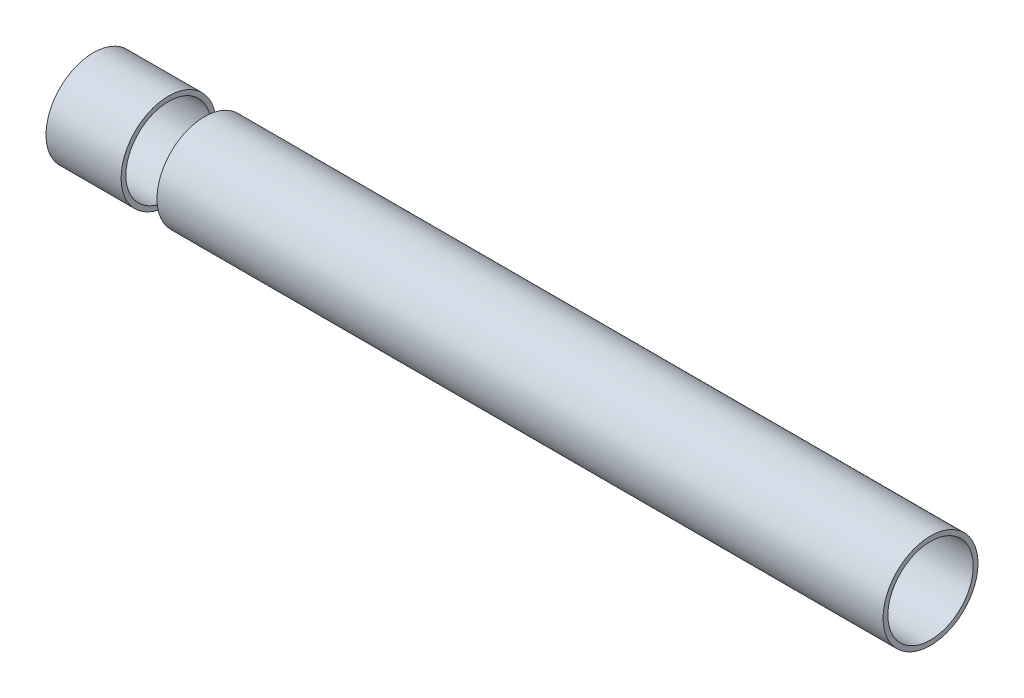
ISO-10303-21;
HEADER;
FILE_DESCRIPTION(('STEP AP214'),'2;1');
FILE_NAME('part.step','',(''),(''),'','','');
FILE_SCHEMA(('AUTOMOTIVE_DESIGN { 1 0 10303 214 1 1 1 1 }'));
ENDSEC;
DATA;
#1=APPLICATION_CONTEXT('core data for automotive mechanical design processes');
#2=APPLICATION_PROTOCOL_DEFINITION('international standard','automotive_design',2000,#1);
#3=PRODUCT_CONTEXT('',#1,'mechanical');
#4=PRODUCT('Part','Part','',(#3));
#5=PRODUCT_RELATED_PRODUCT_CATEGORY('part','',(#4));
#6=PRODUCT_DEFINITION_FORMATION('','',#4);
#7=PRODUCT_DEFINITION_CONTEXT('part definition',#1,'design');
#8=PRODUCT_DEFINITION('design','',#6,#7);
#9=PRODUCT_DEFINITION_SHAPE('','',#8);
#10=(LENGTH_UNIT() NAMED_UNIT(*) SI_UNIT(.MILLI.,.METRE.));
#11=(NAMED_UNIT(*) PLANE_ANGLE_UNIT() SI_UNIT($,.RADIAN.));
#12=(NAMED_UNIT(*) SI_UNIT($,.STERADIAN.) SOLID_ANGLE_UNIT());
#13=UNCERTAINTY_MEASURE_WITH_UNIT(LENGTH_MEASURE(1.E-05),#10,'distance_accuracy_value','');
#14=(GEOMETRIC_REPRESENTATION_CONTEXT(3) GLOBAL_UNCERTAINTY_ASSIGNED_CONTEXT((#13)) GLOBAL_UNIT_ASSIGNED_CONTEXT((#10,
#11,#12)) REPRESENTATION_CONTEXT('',''));
#15=CARTESIAN_POINT('',(0.,0.,0.));
#16=DIRECTION('',(0.,0.,1.));
#17=DIRECTION('',(1.,0.,0.));
#18=AXIS2_PLACEMENT_3D('',#15,#16,#17);
#19=CARTESIAN_POINT('',(140.019255902,0.,0.));
#20=DIRECTION('',(-1.,0.,0.));
#21=DIRECTION('',(0.,0.,1.));
#22=AXIS2_PLACEMENT_3D('',#19,#20,#21);
#23=CYLINDRICAL_SURFACE('',#22,15.875);
#24=CARTESIAN_POINT('',(-140.019255902,0.,0.));
#25=DIRECTION('',(1.,0.,0.));
#26=DIRECTION('',(0.,0.,-1.));
#27=AXIS2_PLACEMENT_3D('',#24,#25,#26);
#28=CIRCLE('',#27,15.875);
#29=CARTESIAN_POINT('',(-140.019255902,0.,-15.875));
#30=VERTEX_POINT('',#29);
#31=EDGE_CURVE('E12',#30,#30,#28,.T.);
#32=ORIENTED_EDGE('',*,*,#31,.T.);
#33=EDGE_LOOP('',(#32));
#34=FACE_BOUND('',#33,.T.);
#35=CARTESIAN_POINT('',(-114.895310976,0.,0.));
#36=DIRECTION('',(-1.,0.,0.));
#37=DIRECTION('',(0.,0.,1.));
#38=AXIS2_PLACEMENT_3D('',#35,#36,#37);
#39=CIRCLE('',#38,15.875);
#40=CARTESIAN_POINT('',(-114.895310976,0.,15.875));
#41=VERTEX_POINT('',#40);
#42=EDGE_CURVE('E68',#41,#41,#39,.T.);
#43=ORIENTED_EDGE('',*,*,#42,.T.);
#44=EDGE_LOOP('',(#43));
#45=FACE_BOUND('',#44,.T.);
#46=ADVANCED_FACE('F57',(#34,#45),#23,.T.);
#47=CARTESIAN_POINT('',(-140.019255902,0.,0.));
#48=DIRECTION('',(1.,0.,0.));
#49=DIRECTION('',(0.,0.,-1.));
#50=AXIS2_PLACEMENT_3D('',#47,#48,#49);
#51=PLANE('',#50);
#52=ORIENTED_EDGE('',*,*,#31,.F.);
#53=EDGE_LOOP('',(#52));
#54=FACE_BOUND('',#53,.T.);
#55=CARTESIAN_POINT('',(-140.019255902,0.,0.));
#56=DIRECTION('',(1.,0.,0.));
#57=DIRECTION('',(0.,0.,-1.));
#58=AXIS2_PLACEMENT_3D('',#55,#56,#57);
#59=CIRCLE('',#58,14.2875);
#60=CARTESIAN_POINT('',(-140.019255902,0.,-14.2875));
#61=VERTEX_POINT('',#60);
#62=EDGE_CURVE('E64',#61,#61,#59,.T.);
#63=ORIENTED_EDGE('',*,*,#62,.T.);
#64=EDGE_LOOP('',(#63));
#65=FACE_BOUND('',#64,.T.);
#66=ADVANCED_FACE('F83',(#54,#65),#51,.F.);
#67=CARTESIAN_POINT('',(140.019255902,0.,0.));
#68=DIRECTION('',(-1.,0.,0.));
#69=DIRECTION('',(0.,0.,1.));
#70=AXIS2_PLACEMENT_3D('',#67,#68,#69);
#71=CYLINDRICAL_SURFACE('',#70,14.2875);
#72=CARTESIAN_POINT('',(-114.895310976,0.,0.));
#73=DIRECTION('',(-1.,0.,0.));
#74=DIRECTION('',(0.,0.,1.));
#75=AXIS2_PLACEMENT_3D('',#72,#73,#74);
#76=CIRCLE('',#75,14.2875);
#77=CARTESIAN_POINT('',(-114.895310976,0.,14.2875));
#78=VERTEX_POINT('',#77);
#79=EDGE_CURVE('E60',#78,#78,#76,.T.);
#80=ORIENTED_EDGE('',*,*,#79,.F.);
#81=EDGE_LOOP('',(#80));
#82=FACE_BOUND('',#81,.T.);
#83=ORIENTED_EDGE('',*,*,#62,.F.);
#84=EDGE_LOOP('',(#83));
#85=FACE_BOUND('',#84,.T.);
#86=ADVANCED_FACE('F80',(#82,#85),#71,.F.);
#87=CARTESIAN_POINT('',(-114.895310976,-15.875,-15.875));
#88=DIRECTION('',(-1.,0.,0.));
#89=DIRECTION('',(0.,0.,1.));
#90=AXIS2_PLACEMENT_3D('',#87,#88,#89);
#91=PLANE('',#90);
#92=ORIENTED_EDGE('',*,*,#79,.T.);
#93=EDGE_LOOP('',(#92));
#94=FACE_BOUND('',#93,.T.);
#95=ORIENTED_EDGE('',*,*,#42,.F.);
#96=EDGE_LOOP('',(#95));
#97=FACE_BOUND('',#96,.T.);
#98=ADVANCED_FACE('F77',(#94,#97),#91,.F.);
#99=CLOSED_SHELL('',(#46,#66,#86,#98));
#100=MANIFOLD_SOLID_BREP('B2',#99);
#101=CARTESIAN_POINT('',(140.019255902,0.,0.));
#102=DIRECTION('',(-1.,0.,0.));
#103=DIRECTION('',(0.,0.,1.));
#104=AXIS2_PLACEMENT_3D('',#101,#102,#103);
#105=CYLINDRICAL_SURFACE('',#104,14.2875);
#106=CARTESIAN_POINT('',(-102.8953111,0.,0.));
#107=DIRECTION('',(1.,0.,0.));
#108=DIRECTION('',(0.,0.,-1.));
#109=AXIS2_PLACEMENT_3D('',#106,#107,#108);
#110=CIRCLE('',#109,14.2875);
#111=CARTESIAN_POINT('',(-102.8953111,0.,-14.2875));
#112=VERTEX_POINT('',#111);
#113=EDGE_CURVE('E56',#112,#112,#110,.T.);
#114=ORIENTED_EDGE('',*,*,#113,.F.);
#115=EDGE_LOOP('',(#114));
#116=FACE_BOUND('',#115,.T.);
#117=CARTESIAN_POINT('',(140.019255902,0.,0.));
#118=DIRECTION('',(1.,0.,0.));
#119=DIRECTION('',(0.,0.,-1.));
#120=AXIS2_PLACEMENT_3D('',#117,#118,#119);
#121=CIRCLE('',#120,14.2875);
#122=CARTESIAN_POINT('',(140.019255902,0.,-14.2875));
#123=VERTEX_POINT('',#122);
#124=EDGE_CURVE('E133',#123,#123,#121,.T.);
#125=ORIENTED_EDGE('',*,*,#124,.T.);
#126=EDGE_LOOP('',(#125));
#127=FACE_BOUND('',#126,.T.);
#128=ADVANCED_FACE('F119',(#116,#127),#105,.F.);
#129=CARTESIAN_POINT('',(140.019255902,0.,0.));
#130=DIRECTION('',(1.,0.,0.));
#131=DIRECTION('',(0.,0.,-1.));
#132=AXIS2_PLACEMENT_3D('',#129,#130,#131);
#133=PLANE('',#132);
#134=CARTESIAN_POINT('',(140.019255902,0.,0.));
#135=DIRECTION('',(1.,0.,0.));
#136=DIRECTION('',(0.,0.,-1.));
#137=AXIS2_PLACEMENT_3D('',#134,#135,#136);
#138=CIRCLE('',#137,15.875);
#139=CARTESIAN_POINT('',(140.019255902,0.,-15.875));
#140=VERTEX_POINT('',#139);
#141=EDGE_CURVE('E130',#140,#140,#138,.T.);
#142=ORIENTED_EDGE('',*,*,#141,.T.);
#143=EDGE_LOOP('',(#142));
#144=FACE_BOUND('',#143,.T.);
#145=ORIENTED_EDGE('',*,*,#124,.F.);
#146=EDGE_LOOP('',(#145));
#147=FACE_BOUND('',#146,.T.);
#148=ADVANCED_FACE('F138',(#144,#147),#133,.T.);
#149=CARTESIAN_POINT('',(140.019255902,0.,0.));
#150=DIRECTION('',(-1.,0.,0.));
#151=DIRECTION('',(0.,0.,1.));
#152=AXIS2_PLACEMENT_3D('',#149,#150,#151);
#153=CYLINDRICAL_SURFACE('',#152,15.875);
#154=CARTESIAN_POINT('',(-102.8953111,0.,0.));
#155=DIRECTION('',(1.,0.,0.));
#156=DIRECTION('',(0.,0.,-1.));
#157=AXIS2_PLACEMENT_3D('',#154,#155,#156);
#158=CIRCLE('',#157,15.875);
#159=CARTESIAN_POINT('',(-102.8953111,0.,-15.875));
#160=VERTEX_POINT('',#159);
#161=EDGE_CURVE('E122',#160,#160,#158,.T.);
#162=ORIENTED_EDGE('',*,*,#161,.T.);
#163=EDGE_LOOP('',(#162));
#164=FACE_BOUND('',#163,.T.);
#165=ORIENTED_EDGE('',*,*,#141,.F.);
#166=EDGE_LOOP('',(#165));
#167=FACE_BOUND('',#166,.T.);
#168=ADVANCED_FACE('F140',(#164,#167),#153,.T.);
#169=CARTESIAN_POINT('',(-102.8953111,-15.875,-15.875));
#170=DIRECTION('',(1.,0.,0.));
#171=DIRECTION('',(0.,0.,-1.));
#172=AXIS2_PLACEMENT_3D('',#169,#170,#171);
#173=PLANE('',#172);
#174=ORIENTED_EDGE('',*,*,#113,.T.);
#175=EDGE_LOOP('',(#174));
#176=FACE_BOUND('',#175,.T.);
#177=ORIENTED_EDGE('',*,*,#161,.F.);
#178=EDGE_LOOP('',(#177));
#179=FACE_BOUND('',#178,.T.);
#180=ADVANCED_FACE('F146',(#176,#179),#173,.F.);
#181=CLOSED_SHELL('',(#128,#148,#168,#180));
#182=MANIFOLD_SOLID_BREP('B7',#181);
#183=ADVANCED_BREP_SHAPE_REPRESENTATION('',(#18,#100,#182),#14);
#184=SHAPE_DEFINITION_REPRESENTATION(#9,#183);
ENDSEC;
END-ISO-10303-21;
